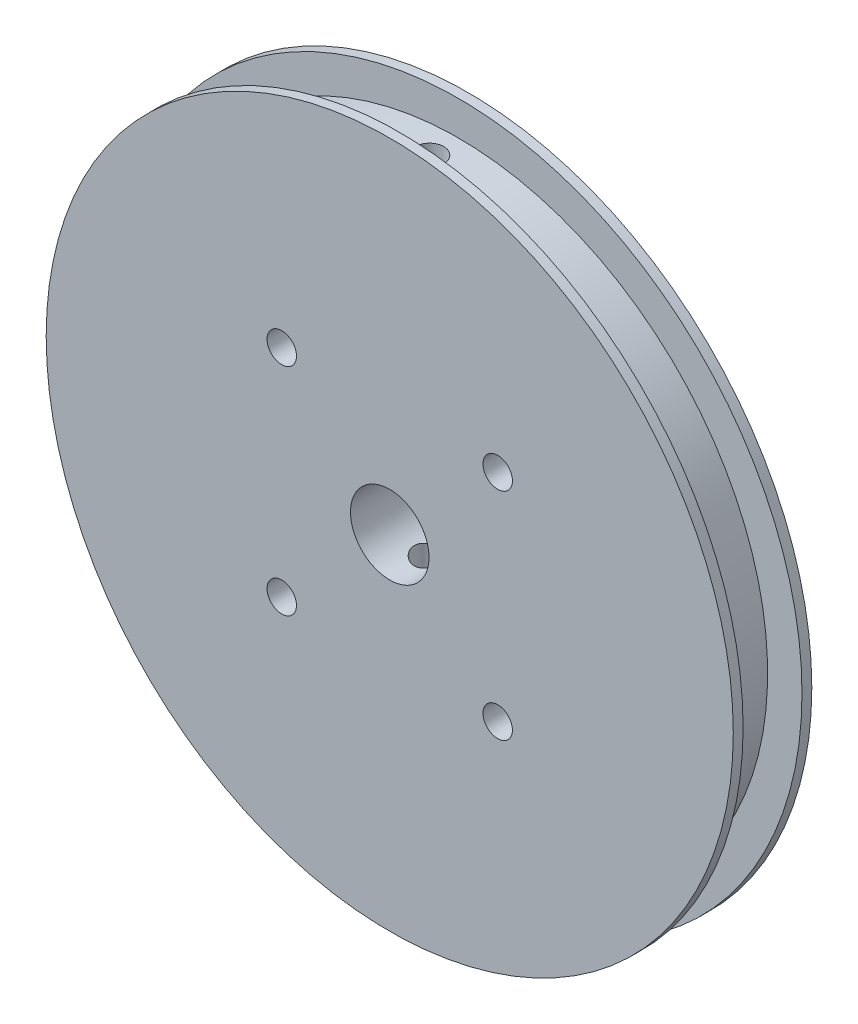
ISO-10303-21;
HEADER;
FILE_DESCRIPTION(('STEP AP214'),'2;1');
FILE_NAME('part.step','',(''),(''),'','','');
FILE_SCHEMA(('AUTOMOTIVE_DESIGN { 1 0 10303 214 1 1 1 1 }'));
ENDSEC;
DATA;
#1=APPLICATION_CONTEXT('core data for automotive mechanical design processes');
#2=APPLICATION_PROTOCOL_DEFINITION('international standard','automotive_design',2000,#1);
#3=PRODUCT_CONTEXT('',#1,'mechanical');
#4=PRODUCT('Part','Part','',(#3));
#5=PRODUCT_RELATED_PRODUCT_CATEGORY('part','',(#4));
#6=PRODUCT_DEFINITION_FORMATION('','',#4);
#7=PRODUCT_DEFINITION_CONTEXT('part definition',#1,'design');
#8=PRODUCT_DEFINITION('design','',#6,#7);
#9=PRODUCT_DEFINITION_SHAPE('','',#8);
#10=(LENGTH_UNIT() NAMED_UNIT(*) SI_UNIT(.MILLI.,.METRE.));
#11=(NAMED_UNIT(*) PLANE_ANGLE_UNIT() SI_UNIT($,.RADIAN.));
#12=(NAMED_UNIT(*) SI_UNIT($,.STERADIAN.) SOLID_ANGLE_UNIT());
#13=UNCERTAINTY_MEASURE_WITH_UNIT(LENGTH_MEASURE(1.E-05),#10,'distance_accuracy_value','');
#14=(GEOMETRIC_REPRESENTATION_CONTEXT(3) GLOBAL_UNCERTAINTY_ASSIGNED_CONTEXT((#13)) GLOBAL_UNIT_ASSIGNED_CONTEXT((#10,
#11,#12)) REPRESENTATION_CONTEXT('',''));
#15=CARTESIAN_POINT('',(0.,0.,0.));
#16=DIRECTION('',(0.,0.,1.));
#17=DIRECTION('',(1.,0.,0.));
#18=AXIS2_PLACEMENT_3D('',#15,#16,#17);
#19=CARTESIAN_POINT('',(0.,0.,8.));
#20=DIRECTION('',(0.,0.,1.));
#21=DIRECTION('',(1.,0.,0.));
#22=AXIS2_PLACEMENT_3D('',#19,#20,#21);
#23=PLANE('',#22);
#24=CARTESIAN_POINT('',(11.,-11.,8.));
#25=DIRECTION('',(0.,0.,1.));
#26=DIRECTION('',(1.,0.,0.));
#27=AXIS2_PLACEMENT_3D('',#24,#25,#26);
#28=CIRCLE('',#27,1.5);
#29=CARTESIAN_POINT('',(12.5,-11.,8.));
#30=VERTEX_POINT('',#29);
#31=EDGE_CURVE('E242',#30,#30,#28,.T.);
#32=ORIENTED_EDGE('',*,*,#31,.F.);
#33=EDGE_LOOP('',(#32));
#34=FACE_BOUND('',#33,.T.);
#35=CARTESIAN_POINT('',(-11.,-11.,8.));
#36=DIRECTION('',(0.,0.,1.));
#37=DIRECTION('',(1.,0.,0.));
#38=AXIS2_PLACEMENT_3D('',#35,#36,#37);
#39=CIRCLE('',#38,1.5);
#40=CARTESIAN_POINT('',(-9.5,-11.,8.));
#41=VERTEX_POINT('',#40);
#42=EDGE_CURVE('E244',#41,#41,#39,.T.);
#43=ORIENTED_EDGE('',*,*,#42,.F.);
#44=EDGE_LOOP('',(#43));
#45=FACE_BOUND('',#44,.T.);
#46=CARTESIAN_POINT('',(-11.,11.,8.));
#47=DIRECTION('',(0.,0.,1.));
#48=DIRECTION('',(1.,0.,0.));
#49=AXIS2_PLACEMENT_3D('',#46,#47,#48);
#50=CIRCLE('',#49,1.5);
#51=CARTESIAN_POINT('',(-9.5,11.,8.));
#52=VERTEX_POINT('',#51);
#53=EDGE_CURVE('E252',#52,#52,#50,.T.);
#54=ORIENTED_EDGE('',*,*,#53,.F.);
#55=EDGE_LOOP('',(#54));
#56=FACE_BOUND('',#55,.T.);
#57=CARTESIAN_POINT('',(11.,11.,8.));
#58=DIRECTION('',(0.,0.,1.));
#59=DIRECTION('',(1.,0.,0.));
#60=AXIS2_PLACEMENT_3D('',#57,#58,#59);
#61=CIRCLE('',#60,1.5);
#62=CARTESIAN_POINT('',(12.5,11.,8.));
#63=VERTEX_POINT('',#62);
#64=EDGE_CURVE('E258',#63,#63,#61,.T.);
#65=ORIENTED_EDGE('',*,*,#64,.F.);
#66=EDGE_LOOP('',(#65));
#67=FACE_BOUND('',#66,.T.);
#68=CARTESIAN_POINT('',(0.,0.,8.));
#69=DIRECTION('',(0.,0.,1.));
#70=DIRECTION('',(1.,0.,0.));
#71=AXIS2_PLACEMENT_3D('',#68,#69,#70);
#72=CIRCLE('',#71,35.);
#73=CARTESIAN_POINT('',(35.,0.,8.));
#74=VERTEX_POINT('',#73);
#75=EDGE_CURVE('E10',#74,#74,#72,.T.);
#76=ORIENTED_EDGE('',*,*,#75,.T.);
#77=EDGE_LOOP('',(#76));
#78=FACE_BOUND('',#77,.T.);
#79=CARTESIAN_POINT('',(0.,0.,8.));
#80=DIRECTION('',(0.,0.,1.));
#81=DIRECTION('',(1.,0.,0.));
#82=AXIS2_PLACEMENT_3D('',#79,#80,#81);
#83=CIRCLE('',#82,4.);
#84=CARTESIAN_POINT('',(4.,0.,8.));
#85=VERTEX_POINT('',#84);
#86=EDGE_CURVE('E87',#85,#85,#83,.T.);
#87=ORIENTED_EDGE('',*,*,#86,.F.);
#88=EDGE_LOOP('',(#87));
#89=FACE_BOUND('',#88,.T.);
#90=ADVANCED_FACE('F33',(#34,#45,#56,#67,#78,#89),#23,.T.);
#91=CARTESIAN_POINT('',(0.,0.,0.));
#92=DIRECTION('',(0.,0.,1.));
#93=DIRECTION('',(1.,0.,0.));
#94=AXIS2_PLACEMENT_3D('',#91,#92,#93);
#95=PLANE('',#94);
#96=CARTESIAN_POINT('',(11.,-11.,0.));
#97=DIRECTION('',(0.,0.,1.));
#98=DIRECTION('',(1.,0.,0.));
#99=AXIS2_PLACEMENT_3D('',#96,#97,#98);
#100=CIRCLE('',#99,1.5);
#101=CARTESIAN_POINT('',(12.5,-11.,0.));
#102=VERTEX_POINT('',#101);
#103=EDGE_CURVE('E240',#102,#102,#100,.F.);
#104=ORIENTED_EDGE('',*,*,#103,.F.);
#105=EDGE_LOOP('',(#104));
#106=FACE_BOUND('',#105,.T.);
#107=CARTESIAN_POINT('',(-11.,-11.,0.));
#108=DIRECTION('',(0.,0.,1.));
#109=DIRECTION('',(1.,0.,0.));
#110=AXIS2_PLACEMENT_3D('',#107,#108,#109);
#111=CIRCLE('',#110,1.5);
#112=CARTESIAN_POINT('',(-9.5,-11.,0.));
#113=VERTEX_POINT('',#112);
#114=EDGE_CURVE('E249',#113,#113,#111,.F.);
#115=ORIENTED_EDGE('',*,*,#114,.F.);
#116=EDGE_LOOP('',(#115));
#117=FACE_BOUND('',#116,.T.);
#118=CARTESIAN_POINT('',(-11.,11.,0.));
#119=DIRECTION('',(0.,0.,1.));
#120=DIRECTION('',(1.,0.,0.));
#121=AXIS2_PLACEMENT_3D('',#118,#119,#120);
#122=CIRCLE('',#121,1.5);
#123=CARTESIAN_POINT('',(-9.5,11.,0.));
#124=VERTEX_POINT('',#123);
#125=EDGE_CURVE('E255',#124,#124,#122,.F.);
#126=ORIENTED_EDGE('',*,*,#125,.F.);
#127=EDGE_LOOP('',(#126));
#128=FACE_BOUND('',#127,.T.);
#129=CARTESIAN_POINT('',(11.,11.,0.));
#130=DIRECTION('',(0.,0.,1.));
#131=DIRECTION('',(1.,0.,0.));
#132=AXIS2_PLACEMENT_3D('',#129,#130,#131);
#133=CIRCLE('',#132,1.5);
#134=CARTESIAN_POINT('',(12.5,11.,0.));
#135=VERTEX_POINT('',#134);
#136=EDGE_CURVE('E260',#135,#135,#133,.F.);
#137=ORIENTED_EDGE('',*,*,#136,.F.);
#138=EDGE_LOOP('',(#137));
#139=FACE_BOUND('',#138,.T.);
#140=CARTESIAN_POINT('',(0.,0.,0.));
#141=DIRECTION('',(0.,0.,1.));
#142=DIRECTION('',(1.,0.,0.));
#143=AXIS2_PLACEMENT_3D('',#140,#141,#142);
#144=CIRCLE('',#143,35.);
#145=CARTESIAN_POINT('',(35.,0.,0.));
#146=VERTEX_POINT('',#145);
#147=EDGE_CURVE('E45',#146,#146,#144,.T.);
#148=ORIENTED_EDGE('',*,*,#147,.F.);
#149=EDGE_LOOP('',(#148));
#150=FACE_BOUND('',#149,.T.);
#151=CARTESIAN_POINT('',(0.,0.,0.));
#152=DIRECTION('',(0.,0.,1.));
#153=DIRECTION('',(1.,0.,0.));
#154=AXIS2_PLACEMENT_3D('',#151,#152,#153);
#155=CIRCLE('',#154,4.);
#156=CARTESIAN_POINT('',(4.,0.,0.));
#157=VERTEX_POINT('',#156);
#158=EDGE_CURVE('E84',#157,#157,#155,.T.);
#159=ORIENTED_EDGE('',*,*,#158,.T.);
#160=EDGE_LOOP('',(#159));
#161=FACE_BOUND('',#160,.T.);
#162=ADVANCED_FACE('F106',(#106,#117,#128,#139,#150,#161),#95,.F.);
#163=CARTESIAN_POINT('',(0.,0.,8.));
#164=DIRECTION('',(0.,0.,-1.));
#165=DIRECTION('',(-1.,0.,0.));
#166=AXIS2_PLACEMENT_3D('',#163,#164,#165);
#167=CYLINDRICAL_SURFACE('',#166,35.);
#168=ORIENTED_EDGE('',*,*,#75,.F.);
#169=EDGE_LOOP('',(#168));
#170=FACE_BOUND('',#169,.T.);
#171=CARTESIAN_POINT('',(0.,0.,7.));
#172=DIRECTION('',(0.,0.,-1.));
#173=DIRECTION('',(-1.,0.,0.));
#174=AXIS2_PLACEMENT_3D('',#171,#172,#173);
#175=CIRCLE('',#174,35.);
#176=CARTESIAN_POINT('',(-35.,0.,7.00000000000001));
#177=VERTEX_POINT('',#176);
#178=EDGE_CURVE('E50',#177,#177,#175,.T.);
#179=ORIENTED_EDGE('',*,*,#178,.F.);
#180=EDGE_LOOP('',(#179));
#181=FACE_BOUND('',#180,.T.);
#182=ADVANCED_FACE('F35',(#170,#181),#167,.T.);
#183=CARTESIAN_POINT('',(35.,0.,7.));
#184=DIRECTION('',(0.,0.,-1.));
#185=DIRECTION('',(-1.,0.,0.));
#186=AXIS2_PLACEMENT_3D('',#183,#184,#185);
#187=PLANE('',#186);
#188=ORIENTED_EDGE('',*,*,#178,.T.);
#189=EDGE_LOOP('',(#188));
#190=FACE_BOUND('',#189,.T.);
#191=CARTESIAN_POINT('',(0.,0.,7.));
#192=DIRECTION('',(0.,0.,-1.));
#193=DIRECTION('',(-1.,0.,0.));
#194=AXIS2_PLACEMENT_3D('',#191,#192,#193);
#195=CIRCLE('',#194,31.5);
#196=CARTESIAN_POINT('',(-31.5,0.,7.00000000000001));
#197=VERTEX_POINT('',#196);
#198=EDGE_CURVE('E95',#197,#197,#195,.T.);
#199=ORIENTED_EDGE('',*,*,#198,.F.);
#200=EDGE_LOOP('',(#199));
#201=FACE_BOUND('',#200,.T.);
#202=ADVANCED_FACE('F102',(#190,#201),#187,.T.);
#203=CARTESIAN_POINT('',(0.,0.,-14.621584360084));
#204=DIRECTION('',(0.,0.,-1.));
#205=DIRECTION('',(-1.,0.,0.));
#206=AXIS2_PLACEMENT_3D('',#203,#204,#205);
#207=CYLINDRICAL_SURFACE('',#206,31.5);
#208=CARTESIAN_POINT('',(0.,-31.5,5.5));
#209=CARTESIAN_POINT('',(0.084204455848316,-31.499999521691,5.49999628203976));
#210=CARTESIAN_POINT('',(0.168468751712296,-31.4996587453911,5.49288579782181));
#211=CARTESIAN_POINT('',(0.334673149945299,-31.4983320818958,5.46462130354209));
#212=CARTESIAN_POINT('',(0.416610389150941,-31.497345433105,5.44345071375604));
#213=CARTESIAN_POINT('',(0.575728966819689,-31.4948387059078,5.3876731986805));
#214=CARTESIAN_POINT('',(0.65291269202419,-31.4933188978105,5.35307308115247));
#215=CARTESIAN_POINT('',(0.800355556424464,-31.4899170574378,5.27142904265496));
#216=CARTESIAN_POINT('',(0.87061633291434,-31.4880351111214,5.22438807371946));
#217=CARTESIAN_POINT('',(1.00230519603713,-31.4841187742428,5.11914877267684));
#218=CARTESIAN_POINT('',(1.06372606919979,-31.4820842612201,5.06094141799967));
#219=CARTESIAN_POINT('',(1.17593020040086,-31.4780931511996,4.935039492245));
#220=CARTESIAN_POINT('',(1.22671302550478,-31.4761365573755,4.86734453523953));
#221=CARTESIAN_POINT('',(1.31621879743016,-31.4725210752653,4.72435196387642));
#222=CARTESIAN_POINT('',(1.35493620473411,-31.4708623238734,4.64905087831281));
#223=CARTESIAN_POINT('',(1.41917652846051,-31.4680310454237,4.49300802714207));
#224=CARTESIAN_POINT('',(1.44469953813332,-31.4668585149296,4.41226629999079));
#225=CARTESIAN_POINT('',(1.48180775756236,-31.4651329921152,4.24769964793653));
#226=CARTESIAN_POINT('',(1.49340362509042,-31.464579526077,4.16387713130643));
#227=CARTESIAN_POINT('',(1.50236127501763,-31.4641531218559,3.9954736242041));
#228=CARTESIAN_POINT('',(1.49972316167506,-31.4642801786886,3.91089263929188));
#229=CARTESIAN_POINT('',(1.48029662365738,-31.4652000518241,3.74344555546357));
#230=CARTESIAN_POINT('',(1.46351971261308,-31.465992326419,3.66057811739432));
#231=CARTESIAN_POINT('',(1.41630965318367,-31.4681524825313,3.49883707195585));
#232=CARTESIAN_POINT('',(1.38587645109471,-31.4695203663124,3.41996348029392));
#233=CARTESIAN_POINT('',(1.31220453600091,-31.4726781890425,3.26841195897975));
#234=CARTESIAN_POINT('',(1.26896056956648,-31.474468301077,3.19573658686635));
#235=CARTESIAN_POINT('',(1.17089849655754,-31.4782686350107,3.05867247094425));
#236=CARTESIAN_POINT('',(1.11608031631733,-31.4802788583107,2.9942837798815));
#237=CARTESIAN_POINT('',(0.996360907755262,-31.4842952453966,2.87555376581213));
#238=CARTESIAN_POINT('',(0.931449707672944,-31.4863014031584,2.82122249694881));
#239=CARTESIAN_POINT('',(0.793421911843063,-31.4900816138081,2.72422705618964));
#240=CARTESIAN_POINT('',(0.720305314195427,-31.4918556666422,2.68156288699548));
#241=CARTESIAN_POINT('',(0.567936393011281,-31.4949717919896,2.60911370967763));
#242=CARTESIAN_POINT('',(0.4886839047752,-31.4963138529025,2.57932904740707));
#243=CARTESIAN_POINT('',(0.326295483006588,-31.498414566215,2.533490910148));
#244=CARTESIAN_POINT('',(0.243159575861256,-31.4991732225783,2.51743734187326));
#245=CARTESIAN_POINT('',(0.0754515337297928,-31.5000211133096,2.49952947567241));
#246=CARTESIAN_POINT('',(-0.00911911303917941,-31.5001110033461,2.49766127017037));
#247=CARTESIAN_POINT('',(-0.177372714227648,-31.4996129706397,2.50814087424912));
#248=CARTESIAN_POINT('',(-0.261055671304648,-31.4990250499266,2.520488641259));
#249=CARTESIAN_POINT('',(-0.425119500667629,-31.4972380426662,2.55903817194659));
#250=CARTESIAN_POINT('',(-0.505501867140966,-31.4960392360398,2.5852335905423));
#251=CARTESIAN_POINT('',(-0.660728763660753,-31.4931654431547,2.65072840035203));
#252=CARTESIAN_POINT('',(-0.735573264819049,-31.4914904544122,2.6900278599171));
#253=CARTESIAN_POINT('',(-0.877663753715548,-31.4878511294527,2.78065082274801));
#254=CARTESIAN_POINT('',(-0.944903786197755,-31.4858865692001,2.83198365431255));
#255=CARTESIAN_POINT('',(-1.06981677218627,-31.4818901191697,2.94520257219547));
#256=CARTESIAN_POINT('',(-1.12748966970351,-31.4798582289981,3.00708872026996));
#257=CARTESIAN_POINT('',(-1.23167803462212,-31.4759542727721,3.13971734834539));
#258=CARTESIAN_POINT('',(-1.27818450758988,-31.4740823363353,3.2104668983864));
#259=CARTESIAN_POINT('',(-1.3586584056499,-31.470711407541,3.35877824808428));
#260=CARTESIAN_POINT('',(-1.39262588151734,-31.4692124136734,3.4363400201543));
#261=CARTESIAN_POINT('',(-1.44704187510975,-31.4667573256386,3.59604071934477));
#262=CARTESIAN_POINT('',(-1.46749613899398,-31.4658010007393,3.67817768484579));
#263=CARTESIAN_POINT('',(-1.49432388586262,-31.4645384401995,3.84472469373968));
#264=CARTESIAN_POINT('',(-1.50069743894383,-31.4642322013228,3.92913472581462));
#265=CARTESIAN_POINT('',(-1.49918216482736,-31.4643044284398,4.09774221147799));
#266=CARTESIAN_POINT('',(-1.49130748991857,-31.4646822150142,4.1819397929119));
#267=CARTESIAN_POINT('',(-1.4615485309083,-31.4660784774312,4.34781611339455));
#268=CARTESIAN_POINT('',(-1.43966421992262,-31.4670969545033,4.42949484760935));
#269=CARTESIAN_POINT('',(-1.38251002568609,-31.4696596550276,4.58801806504841));
#270=CARTESIAN_POINT('',(-1.34724001966805,-31.4712038833017,4.66486250392729));
#271=CARTESIAN_POINT('',(-1.264318206725,-31.4746439832772,4.81153975500084));
#272=CARTESIAN_POINT('',(-1.21666678952803,-31.4765398439098,4.88137278779671));
#273=CARTESIAN_POINT('',(-1.11028463060226,-31.4804716566092,5.01211528835167));
#274=CARTESIAN_POINT('',(-1.05154412998328,-31.4825077310603,5.07301681145825));
#275=CARTESIAN_POINT('',(-0.924655641705977,-31.4864896760628,5.18411288402898));
#276=CARTESIAN_POINT('',(-0.856505341117788,-31.488435524279,5.23430479332447));
#277=CARTESIAN_POINT('',(-0.712682232586394,-31.4920189862803,5.32257814692136));
#278=CARTESIAN_POINT('',(-0.637002616039989,-31.4936563171366,5.36064849688089));
#279=CARTESIAN_POINT('',(-0.480374846358472,-31.49643391671,5.42349726703385));
#280=CARTESIAN_POINT('',(-0.399433052706205,-31.4975747730515,5.4482914089264));
#281=CARTESIAN_POINT('',(-0.264989270668426,-31.4989286585712,5.47737061564));
#282=CARTESIAN_POINT('',(-0.212358375591075,-31.4993286492641,5.48584582353401));
#283=CARTESIAN_POINT('',(-0.106492966230843,-31.4998644711397,5.49716168933256));
#284=CARTESIAN_POINT('',(-0.0532584524123417,-31.5000003025255,5.50000235157162));
#285=CARTESIAN_POINT('',(0.,-31.5,5.5));
#286=B_SPLINE_CURVE_WITH_KNOTS('',3,(#208,#209,#210,#211,#212,#213,#214,#215,#216,#217,#218,
#219,#220,#221,#222,#223,#224,#225,#226,#227,#228,#229,#230,#231,#232,#233,#234,#235,#236,#237,
#238,#239,#240,#241,#242,#243,#244,#245,#246,#247,#248,#249,#250,#251,#252,#253,#254,#255,#256,
#257,#258,#259,#260,#261,#262,#263,#264,#265,#266,#267,#268,#269,#270,#271,#272,#273,#274,#275,
#276,#277,#278,#279,#280,#281,#282,#283,#284,#285),.UNSPECIFIED.,.T.,.F.,(4,2,2,2,2,2,2,2,2,2,2,
2,2,2,2,2,2,2,2,2,2,2,2,2,2,2,2,2,2,2,2,2,2,2,2,2,2,2,4),(0.,0.25241895622826,0.505136095503246,
0.757725293142997,1.01025460871384,1.26298883696178,1.51573334868626,1.76859373098495,
2.0214523261884,2.27411729733235,2.52678041780784,2.77923798600517,3.03169654700951,
3.28425877969904,3.53682261990499,3.78963759397969,4.04245262659729,4.29527444763009,
4.54809455102962,4.80066675316601,5.05323819895602,5.30569401508849,5.55815114805832,
5.81080463738787,6.06345960525139,6.31631740630283,6.56917418342566,6.82192337013215,
7.07467129859598,7.32716831878449,7.57966582351067,7.83216564407918,8.08465751770712,
8.33737264018958,8.59014999102645,8.84315803744839,9.09586580512913,9.25551832202427,
9.41517071610271),.UNSPECIFIED.);
#287=CARTESIAN_POINT('',(0.,-31.5,5.5));
#288=VERTEX_POINT('',#287);
#289=EDGE_CURVE('E58',#288,#288,#286,.T.);
#290=ORIENTED_EDGE('',*,*,#289,.T.);
#291=EDGE_LOOP('',(#290));
#292=FACE_BOUND('',#291,.T.);
#293=CARTESIAN_POINT('',(0.,31.5,2.5));
#294=CARTESIAN_POINT('',(-0.0842044558483151,31.499999521691,2.50000371796024));
#295=CARTESIAN_POINT('',(-0.168468751712295,31.4996587453911,2.50711420217819));
#296=CARTESIAN_POINT('',(-0.334673149945298,31.4983320818958,2.53537869645791));
#297=CARTESIAN_POINT('',(-0.41661038915094,31.497345433105,2.55654928624396));
#298=CARTESIAN_POINT('',(-0.575728966819689,31.4948387059078,2.6123268013195));
#299=CARTESIAN_POINT('',(-0.65291269202419,31.4933188978105,2.64692691884753));
#300=CARTESIAN_POINT('',(-0.800355556424463,31.4899170574378,2.72857095734504));
#301=CARTESIAN_POINT('',(-0.870616332914339,31.4880351111214,2.77561192628054));
#302=CARTESIAN_POINT('',(-1.00230519603713,31.4841187742428,2.88085122732316));
#303=CARTESIAN_POINT('',(-1.06372606919979,31.4820842612201,2.93905858200033));
#304=CARTESIAN_POINT('',(-1.17593020040086,31.4780931511996,3.064960507755));
#305=CARTESIAN_POINT('',(-1.22671302550478,31.4761365573755,3.13265546476047));
#306=CARTESIAN_POINT('',(-1.31621879743016,31.4725210752653,3.27564803612357));
#307=CARTESIAN_POINT('',(-1.35493620473411,31.4708623238734,3.35094912168719));
#308=CARTESIAN_POINT('',(-1.41917652846051,31.4680310454237,3.50699197285793));
#309=CARTESIAN_POINT('',(-1.44469953813332,31.4668585149296,3.5877337000092));
#310=CARTESIAN_POINT('',(-1.48180775756236,31.4651329921152,3.75230035206347));
#311=CARTESIAN_POINT('',(-1.49340362509042,31.464579526077,3.83612286869357));
#312=CARTESIAN_POINT('',(-1.50236127501763,31.4641531218559,4.0045263757959));
#313=CARTESIAN_POINT('',(-1.49972316167506,31.4642801786886,4.08910736070812));
#314=CARTESIAN_POINT('',(-1.48029662365738,31.4652000518241,4.25655444453643));
#315=CARTESIAN_POINT('',(-1.46351971261308,31.465992326419,4.33942188260568));
#316=CARTESIAN_POINT('',(-1.41630965318367,31.4681524825313,4.50116292804415));
#317=CARTESIAN_POINT('',(-1.38587645109471,31.4695203663124,4.58003651970608));
#318=CARTESIAN_POINT('',(-1.31220453600091,31.4726781890425,4.73158804102025));
#319=CARTESIAN_POINT('',(-1.26896056956648,31.474468301077,4.80426341313365));
#320=CARTESIAN_POINT('',(-1.17089849655754,31.4782686350107,4.94132752905575));
#321=CARTESIAN_POINT('',(-1.11608031631733,31.4802788583107,5.0057162201185));
#322=CARTESIAN_POINT('',(-0.996360907755261,31.4842952453966,5.12444623418787));
#323=CARTESIAN_POINT('',(-0.931449707672943,31.4863014031584,5.17877750305119));
#324=CARTESIAN_POINT('',(-0.793421911843061,31.4900816138081,5.27577294381036));
#325=CARTESIAN_POINT('',(-0.720305314195426,31.4918556666422,5.31843711300452));
#326=CARTESIAN_POINT('',(-0.56793639301128,31.4949717919896,5.39088629032237));
#327=CARTESIAN_POINT('',(-0.488683904775199,31.4963138529025,5.42067095259293));
#328=CARTESIAN_POINT('',(-0.326295483006587,31.498414566215,5.466509089852));
#329=CARTESIAN_POINT('',(-0.243159575861255,31.4991732225783,5.48256265812674));
#330=CARTESIAN_POINT('',(-0.0754515337297919,31.5000211133096,5.50047052432759));
#331=CARTESIAN_POINT('',(0.00911911303918021,31.5001110033461,5.50233872982962));
#332=CARTESIAN_POINT('',(0.177372714227649,31.4996129706397,5.49185912575088));
#333=CARTESIAN_POINT('',(0.261055671304649,31.4990250499266,5.479511358741));
#334=CARTESIAN_POINT('',(0.425119500667631,31.4972380426662,5.44096182805341));
#335=CARTESIAN_POINT('',(0.505501867140968,31.4960392360398,5.4147664094577));
#336=CARTESIAN_POINT('',(0.660728763660755,31.4931654431547,5.34927159964797));
#337=CARTESIAN_POINT('',(0.735573264819051,31.4914904544122,5.3099721400829));
#338=CARTESIAN_POINT('',(0.87766375371555,31.4878511294527,5.21934917725199));
#339=CARTESIAN_POINT('',(0.944903786197757,31.4858865692001,5.16801634568744));
#340=CARTESIAN_POINT('',(1.06981677218627,31.4818901191697,5.05479742780453));
#341=CARTESIAN_POINT('',(1.12748966970351,31.4798582289981,4.99291127973003));
#342=CARTESIAN_POINT('',(1.23167803462213,31.4759542727721,4.86028265165461));
#343=CARTESIAN_POINT('',(1.27818450758988,31.4740823363353,4.7895331016136));
#344=CARTESIAN_POINT('',(1.35865840564991,31.470711407541,4.64122175191572));
#345=CARTESIAN_POINT('',(1.39262588151735,31.4692124136734,4.5636599798457));
#346=CARTESIAN_POINT('',(1.44704187510975,31.4667573256386,4.40395928065523));
#347=CARTESIAN_POINT('',(1.46749613899398,31.4658010007393,4.32182231515421));
#348=CARTESIAN_POINT('',(1.49432388586262,31.4645384401995,4.15527530626032));
#349=CARTESIAN_POINT('',(1.50069743894383,31.4642322013228,4.07086527418538));
#350=CARTESIAN_POINT('',(1.49918216482736,31.4643044284398,3.90225778852201));
#351=CARTESIAN_POINT('',(1.49130748991858,31.4646822150142,3.8180602070881));
#352=CARTESIAN_POINT('',(1.4615485309083,31.4660784774312,3.65218388660545));
#353=CARTESIAN_POINT('',(1.43966421992262,31.4670969545033,3.57050515239065));
#354=CARTESIAN_POINT('',(1.38251002568609,31.4696596550276,3.41198193495159));
#355=CARTESIAN_POINT('',(1.34724001966805,31.4712038833017,3.33513749607271));
#356=CARTESIAN_POINT('',(1.264318206725,31.4746439832772,3.18846024499915));
#357=CARTESIAN_POINT('',(1.21666678952803,31.4765398439098,3.11862721220329));
#358=CARTESIAN_POINT('',(1.11028463060226,31.4804716566092,2.98788471164832));
#359=CARTESIAN_POINT('',(1.05154412998328,31.4825077310603,2.92698318854175));
#360=CARTESIAN_POINT('',(0.924655641705977,31.4864896760628,2.81588711597102));
#361=CARTESIAN_POINT('',(0.856505341117788,31.488435524279,2.76569520667553));
#362=CARTESIAN_POINT('',(0.712682232586395,31.4920189862803,2.67742185307863));
#363=CARTESIAN_POINT('',(0.63700261603999,31.4936563171366,2.63935150311911));
#364=CARTESIAN_POINT('',(0.480374846358473,31.49643391671,2.57650273296615));
#365=CARTESIAN_POINT('',(0.399433052706206,31.4975747730515,2.5517085910736));
#366=CARTESIAN_POINT('',(0.264989270668427,31.4989286585712,2.52262938436));
#367=CARTESIAN_POINT('',(0.212358375591076,31.4993286492641,2.51415417646599));
#368=CARTESIAN_POINT('',(0.106492966230844,31.4998644711397,2.50283831066744));
#369=CARTESIAN_POINT('',(0.0532584524123427,31.5000003025255,2.49999764842838));
#370=CARTESIAN_POINT('',(0.,31.5,2.5));
#371=B_SPLINE_CURVE_WITH_KNOTS('',3,(#293,#294,#295,#296,#297,#298,#299,#300,#301,#302,#303,
#304,#305,#306,#307,#308,#309,#310,#311,#312,#313,#314,#315,#316,#317,#318,#319,#320,#321,#322,
#323,#324,#325,#326,#327,#328,#329,#330,#331,#332,#333,#334,#335,#336,#337,#338,#339,#340,#341,
#342,#343,#344,#345,#346,#347,#348,#349,#350,#351,#352,#353,#354,#355,#356,#357,#358,#359,#360,
#361,#362,#363,#364,#365,#366,#367,#368,#369,#370),.UNSPECIFIED.,.T.,.F.,(4,2,2,2,2,2,2,2,2,2,2,
2,2,2,2,2,2,2,2,2,2,2,2,2,2,2,2,2,2,2,2,2,2,2,2,2,2,2,4),(0.,0.25241895622826,0.505136095503246,
0.757725293142997,1.01025460871384,1.26298883696178,1.51573334868626,1.76859373098495,
2.0214523261884,2.27411729733235,2.52678041780784,2.77923798600517,3.03169654700951,
3.28425877969904,3.53682261990499,3.78963759397969,4.04245262659729,4.29527444763009,
4.54809455102962,4.80066675316601,5.05323819895602,5.30569401508849,5.55815114805832,
5.81080463738787,6.06345960525139,6.31631740630283,6.56917418342566,6.82192337013215,
7.07467129859598,7.32716831878449,7.57966582351067,7.83216564407918,8.08465751770712,
8.33737264018958,8.59014999102645,8.84315803744839,9.09586580512913,9.25551832202427,
9.41517071610271),.UNSPECIFIED.);
#372=CARTESIAN_POINT('',(0.,31.5,2.5));
#373=VERTEX_POINT('',#372);
#374=EDGE_CURVE('E80',#373,#373,#371,.T.);
#375=ORIENTED_EDGE('',*,*,#374,.F.);
#376=EDGE_LOOP('',(#375));
#377=FACE_BOUND('',#376,.T.);
#378=ORIENTED_EDGE('',*,*,#198,.T.);
#379=EDGE_LOOP('',(#378));
#380=FACE_BOUND('',#379,.T.);
#381=CARTESIAN_POINT('',(0.,0.,1.));
#382=DIRECTION('',(0.,0.,-1.));
#383=DIRECTION('',(-1.,0.,0.));
#384=AXIS2_PLACEMENT_3D('',#381,#382,#383);
#385=CIRCLE('',#384,31.5);
#386=CARTESIAN_POINT('',(-31.5,0.,1.00000000000001));
#387=VERTEX_POINT('',#386);
#388=EDGE_CURVE('E93',#387,#387,#385,.T.);
#389=ORIENTED_EDGE('',*,*,#388,.F.);
#390=EDGE_LOOP('',(#389));
#391=FACE_BOUND('',#390,.T.);
#392=ADVANCED_FACE('F113',(#292,#377,#380,#391),#207,.T.);
#393=CARTESIAN_POINT('',(35.,0.,1.));
#394=DIRECTION('',(0.,0.,1.));
#395=DIRECTION('',(1.,0.,0.));
#396=AXIS2_PLACEMENT_3D('',#393,#394,#395);
#397=PLANE('',#396);
#398=ORIENTED_EDGE('',*,*,#388,.T.);
#399=EDGE_LOOP('',(#398));
#400=FACE_BOUND('',#399,.T.);
#401=CARTESIAN_POINT('',(0.,0.,1.00000000000001));
#402=DIRECTION('',(0.,0.,-1.));
#403=DIRECTION('',(-1.,0.,0.));
#404=AXIS2_PLACEMENT_3D('',#401,#402,#403);
#405=CIRCLE('',#404,35.);
#406=CARTESIAN_POINT('',(-35.,0.,1.00000000000001));
#407=VERTEX_POINT('',#406);
#408=EDGE_CURVE('E90',#407,#407,#405,.T.);
#409=ORIENTED_EDGE('',*,*,#408,.F.);
#410=EDGE_LOOP('',(#409));
#411=FACE_BOUND('',#410,.T.);
#412=ADVANCED_FACE('F117',(#400,#411),#397,.T.);
#413=ORIENTED_EDGE('',*,*,#147,.T.);
#414=EDGE_LOOP('',(#413));
#415=FACE_BOUND('',#414,.T.);
#416=ORIENTED_EDGE('',*,*,#408,.T.);
#417=EDGE_LOOP('',(#416));
#418=FACE_BOUND('',#417,.T.);
#419=ADVANCED_FACE('F108',(#415,#418),#167,.T.);
#420=CARTESIAN_POINT('',(0.,0.,19.3137084989848));
#421=DIRECTION('',(0.,0.,-1.));
#422=DIRECTION('',(-1.,0.,0.));
#423=AXIS2_PLACEMENT_3D('',#420,#421,#422);
#424=CYLINDRICAL_SURFACE('',#423,4.);
#425=CARTESIAN_POINT('',(0.,-3.99999999999999,5.5));
#426=CARTESIAN_POINT('',(0.0812350589378535,-4.00000217456151,5.50000290230311));
#427=CARTESIAN_POINT('',(0.162450241781793,-3.99750379283184,5.49338023975162));
#428=CARTESIAN_POINT('',(0.322453452352362,-3.98778696006928,5.46717180473007));
#429=CARTESIAN_POINT('',(0.401241827987616,-3.98056918893993,5.44758789952943));
#430=CARTESIAN_POINT('',(0.554060784990879,-3.96218832391545,5.39624699822824));
#431=CARTESIAN_POINT('',(0.628100224162278,-3.9510328434944,5.36451348317821));
#432=CARTESIAN_POINT('',(0.769799310160254,-3.92588767765353,5.28989358698418));
#433=CARTESIAN_POINT('',(0.83745723917788,-3.91189723227548,5.24700421445584));
#434=CARTESIAN_POINT('',(0.967346417045826,-3.88186246971217,5.14938746892909));
#435=CARTESIAN_POINT('',(1.02927073015119,-3.86576002583566,5.0942697377406));
#436=CARTESIAN_POINT('',(1.14324421474363,-3.83360220871327,4.97458956534116));
#437=CARTESIAN_POINT('',(1.19529036359203,-3.81754685135033,4.91002424391212));
#438=CARTESIAN_POINT('',(1.28998202215985,-3.78662470617731,4.77028253247679));
#439=CARTESIAN_POINT('',(1.3321939319576,-3.77182648820818,4.69479563345418));
#440=CARTESIAN_POINT('',(1.40318646334084,-3.74599860237433,4.53715164583148));
#441=CARTESIAN_POINT('',(1.43197244961239,-3.73496742975881,4.4549972368449));
#442=CARTESIAN_POINT('',(1.47408431017549,-3.71854412824136,4.2898832597418));
#443=CARTESIAN_POINT('',(1.48799593218558,-3.71293924350838,4.20709496156456));
#444=CARTESIAN_POINT('',(1.50179556531648,-3.70738061461215,4.04018384200616));
#445=CARTESIAN_POINT('',(1.50168936802631,-3.70742453659305,3.95606158612553));
#446=CARTESIAN_POINT('',(1.48790429610018,-3.71297511632055,3.79423047478704));
#447=CARTESIAN_POINT('',(1.47503808509003,-3.71815468871122,3.71643909395582));
#448=CARTESIAN_POINT('',(1.4374416786833,-3.7328493805953,3.56421284959468));
#449=CARTESIAN_POINT('',(1.41270969663258,-3.74236515298863,3.48977849338612));
#450=CARTESIAN_POINT('',(1.35163748571904,-3.76485702190253,3.34472293227177));
#451=CARTESIAN_POINT('',(1.31508648737101,-3.77789517988166,3.2742005138787));
#452=CARTESIAN_POINT('',(1.23156073762698,-3.80594210139319,3.14005426240903));
#453=CARTESIAN_POINT('',(1.18458238728897,-3.82095154457158,3.0764328224803));
#454=CARTESIAN_POINT('',(1.07781780766549,-3.85248038859113,2.95339633634912));
#455=CARTESIAN_POINT('',(1.01738298716956,-3.86903347455671,2.89455135925191));
#456=CARTESIAN_POINT('',(0.887312590819021,-3.90091728164085,2.7876620337942));
#457=CARTESIAN_POINT('',(0.817675603497364,-3.91624781465952,2.73961934539433));
#458=CARTESIAN_POINT('',(0.66972343699242,-3.9442639480908,2.65506960293748));
#459=CARTESIAN_POINT('',(0.59129071384472,-3.95690498259616,2.61875241877894));
#460=CARTESIAN_POINT('',(0.428836850524584,-3.97778718326962,2.56001739572996));
#461=CARTESIAN_POINT('',(0.344818210845768,-3.98603030341493,2.53759338343888));
#462=CARTESIAN_POINT('',(0.178375243148666,-3.99684443228065,2.50837721245806));
#463=CARTESIAN_POINT('',(0.09610361956221,-3.99969369025686,2.50081739361749));
#464=CARTESIAN_POINT('',(-0.0685724752550237,-4.00025893700126,2.49930893610008));
#465=CARTESIAN_POINT('',(-0.150976912983372,-3.99797606386863,2.50535727968322));
#466=CARTESIAN_POINT('',(-0.310262048561859,-3.98871709772643,2.53031004230867));
#467=CARTESIAN_POINT('',(-0.387233328007336,-3.98192470962305,2.54871154373708));
#468=CARTESIAN_POINT('',(-0.536941754957221,-3.96451477091717,2.59718607254732));
#469=CARTESIAN_POINT('',(-0.609678350347534,-3.9538967228203,2.62726061794804));
#470=CARTESIAN_POINT('',(-0.751247765110155,-3.92949624407681,2.69918641243947));
#471=CARTESIAN_POINT('',(-0.819903083557796,-3.91563000209348,2.74135772922339));
#472=CARTESIAN_POINT('',(-0.949392711726626,-3.88626671564664,2.83591810317156));
#473=CARTESIAN_POINT('',(-1.01022412027045,-3.87076907009516,2.88831093254515));
#474=CARTESIAN_POINT('',(-1.12603079874454,-3.8387332949099,3.00540412212427));
#475=CARTESIAN_POINT('',(-1.18046154123568,-3.82218696503729,3.0706421827727));
#476=CARTESIAN_POINT('',(-1.27771050031903,-3.79078815746854,3.20965138470766));
#477=CARTESIAN_POINT('',(-1.32052767414518,-3.77593583194399,3.2834232913885));
#478=CARTESIAN_POINT('',(-1.39337773518998,-3.74966829822463,3.43801598677231));
#479=CARTESIAN_POINT('',(-1.42335685446918,-3.73826760328493,3.51886474591044));
#480=CARTESIAN_POINT('',(-1.46907883466889,-3.72054032891005,3.68500976368782));
#481=CARTESIAN_POINT('',(-1.48483050305535,-3.71421061057491,3.77030323619812));
#482=CARTESIAN_POINT('',(-1.50086347097839,-3.70775894792573,3.93701615954111));
#483=CARTESIAN_POINT('',(-1.50207331495837,-3.70726444523341,4.01833263171689));
#484=CARTESIAN_POINT('',(-1.49136715641593,-3.71158412745292,4.17994531627617));
#485=CARTESIAN_POINT('',(-1.47945239850123,-3.71639780898899,4.26024162467158));
#486=CARTESIAN_POINT('',(-1.44355815630242,-3.73048141585432,4.41504722671655));
#487=CARTESIAN_POINT('',(-1.41995798316524,-3.73961085376663,4.48965834624535));
#488=CARTESIAN_POINT('',(-1.3616969677992,-3.76121548297845,4.63390550849442));
#489=CARTESIAN_POINT('',(-1.32703332944944,-3.77369151995215,4.70354028807014));
#490=CARTESIAN_POINT('',(-1.24552075938154,-3.80139723903965,4.83982678969763));
#491=CARTESIAN_POINT('',(-1.1981283280301,-3.81673698440964,4.90613079679991));
#492=CARTESIAN_POINT('',(-1.09334485729906,-3.84806246757177,5.0301415609712));
#493=CARTESIAN_POINT('',(-1.03595064012808,-3.86404840943145,5.08784557478675));
#494=CARTESIAN_POINT('',(-0.909080396784621,-3.89590424609881,5.19620195582184));
#495=CARTESIAN_POINT('',(-0.83911864421299,-3.91172104900645,5.24630375343467));
#496=CARTESIAN_POINT('',(-0.691213223200818,-3.94054514457031,5.33402265527656));
#497=CARTESIAN_POINT('',(-0.613268934090619,-3.95355221851559,5.37163878773637));
#498=CARTESIAN_POINT('',(-0.44799908200231,-3.9757429260668,5.43437682904833));
#499=CARTESIAN_POINT('',(-0.360413422234207,-3.98473657158356,5.4588870646019));
#500=CARTESIAN_POINT('',(-0.181875733606382,-3.99686242179586,5.49169295992068));
#501=CARTESIAN_POINT('',(-0.0909254163648586,-3.99999756603966,5.49999675148732));
#502=CARTESIAN_POINT('',(0.,-3.99999999999999,5.5));
#503=B_SPLINE_CURVE_WITH_KNOTS('',3,(#425,#426,#427,#428,#429,#430,#431,#432,#433,#434,#435,
#436,#437,#438,#439,#440,#441,#442,#443,#444,#445,#446,#447,#448,#449,#450,#451,#452,#453,#454,
#455,#456,#457,#458,#459,#460,#461,#462,#463,#464,#465,#466,#467,#468,#469,#470,#471,#472,#473,
#474,#475,#476,#477,#478,#479,#480,#481,#482,#483,#484,#485,#486,#487,#488,#489,#490,#491,#492,
#493,#494,#495,#496,#497,#498,#499,#500,#501,#502),.UNSPECIFIED.,.T.,.F.,(4,2,2,2,2,2,2,2,2,2,2,
2,2,2,2,2,2,2,2,2,2,2,2,2,2,2,2,2,2,2,2,2,2,2,2,2,2,2,4),(0.,0.24336980156056,0.486704549530461,
0.729571369213573,0.97250337960949,1.22473618582715,1.47704604925622,1.73896674501659,
2.00078269352134,2.25185874416901,2.50283106079707,2.73878345119971,2.97477138060589,
3.21522408387018,3.45575990744259,3.71246153335813,3.96920257905066,4.22991375286075,
4.49050899698846,4.73725019635925,4.9839366839052,5.2211443792384,5.45838293254453,
5.702592218596,5.94689180019868,6.20536519455658,6.46386178920141,6.72343066727204,
6.98283874956507,7.22558763480252,7.46831350211259,7.70363142426533,7.93900886656506,
8.18672471884271,8.43451941997062,8.69572329654039,8.95694749805102,9.22948515032042,
9.50188601796127),.UNSPECIFIED.);
#504=CARTESIAN_POINT('',(0.,-3.99999999999999,5.5));
#505=VERTEX_POINT('',#504);
#506=EDGE_CURVE('E37',#505,#505,#503,.T.);
#507=ORIENTED_EDGE('',*,*,#506,.F.);
#508=EDGE_LOOP('',(#507));
#509=FACE_BOUND('',#508,.T.);
#510=CARTESIAN_POINT('',(0.,4.00000000000001,5.5));
#511=CARTESIAN_POINT('',(-0.0812350589378522,4.00000217456152,5.50000290230311));
#512=CARTESIAN_POINT('',(-0.162450241781791,3.99750379283184,5.49338023975162));
#513=CARTESIAN_POINT('',(-0.32245345235236,3.98778696006928,5.46717180473007));
#514=CARTESIAN_POINT('',(-0.401241827987615,3.98056918893993,5.44758789952943));
#515=CARTESIAN_POINT('',(-0.554060784990878,3.96218832391545,5.39624699822824));
#516=CARTESIAN_POINT('',(-0.628100224162277,3.9510328434944,5.36451348317821));
#517=CARTESIAN_POINT('',(-0.769799310160253,3.92588767765353,5.28989358698418));
#518=CARTESIAN_POINT('',(-0.837457239177878,3.91189723227548,5.24700421445584));
#519=CARTESIAN_POINT('',(-0.967346417045824,3.88186246971217,5.14938746892909));
#520=CARTESIAN_POINT('',(-1.02927073015119,3.86576002583566,5.0942697377406));
#521=CARTESIAN_POINT('',(-1.14324421474363,3.83360220871327,4.97458956534116));
#522=CARTESIAN_POINT('',(-1.19529036359202,3.81754685135033,4.91002424391213));
#523=CARTESIAN_POINT('',(-1.28998202215985,3.78662470617731,4.77028253247679));
#524=CARTESIAN_POINT('',(-1.3321939319576,3.77182648820818,4.69479563345418));
#525=CARTESIAN_POINT('',(-1.40318646334084,3.74599860237433,4.53715164583148));
#526=CARTESIAN_POINT('',(-1.43197244961239,3.73496742975881,4.4549972368449));
#527=CARTESIAN_POINT('',(-1.47408431017549,3.71854412824136,4.2898832597418));
#528=CARTESIAN_POINT('',(-1.48799593218558,3.71293924350838,4.20709496156456));
#529=CARTESIAN_POINT('',(-1.50179556531648,3.70738061461215,4.04018384200616));
#530=CARTESIAN_POINT('',(-1.5016893680263,3.70742453659305,3.95606158612553));
#531=CARTESIAN_POINT('',(-1.48790429610018,3.71297511632055,3.79423047478704));
#532=CARTESIAN_POINT('',(-1.47503808509003,3.71815468871122,3.71643909395582));
#533=CARTESIAN_POINT('',(-1.4374416786833,3.73284938059529,3.56421284959468));
#534=CARTESIAN_POINT('',(-1.41270969663258,3.74236515298863,3.48977849338612));
#535=CARTESIAN_POINT('',(-1.35163748571904,3.76485702190253,3.34472293227177));
#536=CARTESIAN_POINT('',(-1.31508648737101,3.77789517988166,3.2742005138787));
#537=CARTESIAN_POINT('',(-1.23156073762698,3.80594210139319,3.14005426240903));
#538=CARTESIAN_POINT('',(-1.18458238728897,3.82095154457158,3.0764328224803));
#539=CARTESIAN_POINT('',(-1.07781780766549,3.85248038859113,2.95339633634912));
#540=CARTESIAN_POINT('',(-1.01738298716955,3.86903347455671,2.89455135925191));
#541=CARTESIAN_POINT('',(-0.88731259081902,3.90091728164085,2.7876620337942));
#542=CARTESIAN_POINT('',(-0.817675603497364,3.91624781465952,2.73961934539433));
#543=CARTESIAN_POINT('',(-0.669723436992419,3.9442639480908,2.65506960293748));
#544=CARTESIAN_POINT('',(-0.591290713844719,3.95690498259616,2.61875241877894));
#545=CARTESIAN_POINT('',(-0.428836850524583,3.97778718326962,2.56001739572996));
#546=CARTESIAN_POINT('',(-0.344818210845767,3.98603030341493,2.53759338343888));
#547=CARTESIAN_POINT('',(-0.178375243148665,3.99684443228065,2.50837721245806));
#548=CARTESIAN_POINT('',(-0.0961036195622096,3.99969369025686,2.50081739361749));
#549=CARTESIAN_POINT('',(0.0685724752550239,4.00025893700126,2.49930893610008));
#550=CARTESIAN_POINT('',(0.150976912983372,3.99797606386863,2.50535727968322));
#551=CARTESIAN_POINT('',(0.310262048561859,3.98871709772643,2.53031004230867));
#552=CARTESIAN_POINT('',(0.387233328007336,3.98192470962305,2.54871154373708));
#553=CARTESIAN_POINT('',(0.536941754957221,3.96451477091717,2.59718607254732));
#554=CARTESIAN_POINT('',(0.609678350347534,3.9538967228203,2.62726061794804));
#555=CARTESIAN_POINT('',(0.751247765110156,3.92949624407681,2.69918641243947));
#556=CARTESIAN_POINT('',(0.819903083557796,3.91563000209348,2.74135772922339));
#557=CARTESIAN_POINT('',(0.949392711726626,3.88626671564664,2.83591810317156));
#558=CARTESIAN_POINT('',(1.01022412027045,3.87076907009516,2.88831093254515));
#559=CARTESIAN_POINT('',(1.12603079874454,3.8387332949099,3.00540412212427));
#560=CARTESIAN_POINT('',(1.18046154123569,3.82218696503729,3.0706421827727));
#561=CARTESIAN_POINT('',(1.27771050031903,3.79078815746854,3.20965138470766));
#562=CARTESIAN_POINT('',(1.32052767414518,3.77593583194399,3.2834232913885));
#563=CARTESIAN_POINT('',(1.39337773518998,3.74966829822463,3.43801598677231));
#564=CARTESIAN_POINT('',(1.42335685446918,3.73826760328493,3.51886474591043));
#565=CARTESIAN_POINT('',(1.46907883466889,3.72054032891005,3.68500976368782));
#566=CARTESIAN_POINT('',(1.48483050305535,3.71421061057491,3.77030323619812));
#567=CARTESIAN_POINT('',(1.50086347097839,3.70775894792573,3.93701615954111));
#568=CARTESIAN_POINT('',(1.50207331495837,3.70726444523341,4.01833263171688));
#569=CARTESIAN_POINT('',(1.49136715641593,3.71158412745292,4.17994531627616));
#570=CARTESIAN_POINT('',(1.47945239850124,3.71639780898899,4.26024162467158));
#571=CARTESIAN_POINT('',(1.44355815630242,3.73048141585432,4.41504722671655));
#572=CARTESIAN_POINT('',(1.41995798316524,3.73961085376663,4.48965834624534));
#573=CARTESIAN_POINT('',(1.3616969677992,3.76121548297845,4.63390550849442));
#574=CARTESIAN_POINT('',(1.32703332944945,3.77369151995215,4.70354028807014));
#575=CARTESIAN_POINT('',(1.24552075938154,3.80139723903965,4.83982678969763));
#576=CARTESIAN_POINT('',(1.1981283280301,3.81673698440964,4.90613079679991));
#577=CARTESIAN_POINT('',(1.09334485729906,3.84806246757177,5.0301415609712));
#578=CARTESIAN_POINT('',(1.03595064012808,3.86404840943145,5.08784557478675));
#579=CARTESIAN_POINT('',(0.909080396784623,3.89590424609881,5.19620195582184));
#580=CARTESIAN_POINT('',(0.839118644212993,3.91172104900645,5.24630375343467));
#581=CARTESIAN_POINT('',(0.691213223200822,3.94054514457031,5.33402265527655));
#582=CARTESIAN_POINT('',(0.613268934090622,3.95355221851559,5.37163878773637));
#583=CARTESIAN_POINT('',(0.447999082002313,3.9757429260668,5.43437682904833));
#584=CARTESIAN_POINT('',(0.360413422234209,3.98473657158356,5.4588870646019));
#585=CARTESIAN_POINT('',(0.181875733606383,3.99686242179587,5.49169295992068));
#586=CARTESIAN_POINT('',(0.0909254163648597,3.99999756603968,5.49999675148732));
#587=CARTESIAN_POINT('',(0.,4.00000000000001,5.5));
#588=B_SPLINE_CURVE_WITH_KNOTS('',3,(#510,#511,#512,#513,#514,#515,#516,#517,#518,#519,#520,
#521,#522,#523,#524,#525,#526,#527,#528,#529,#530,#531,#532,#533,#534,#535,#536,#537,#538,#539,
#540,#541,#542,#543,#544,#545,#546,#547,#548,#549,#550,#551,#552,#553,#554,#555,#556,#557,#558,
#559,#560,#561,#562,#563,#564,#565,#566,#567,#568,#569,#570,#571,#572,#573,#574,#575,#576,#577,
#578,#579,#580,#581,#582,#583,#584,#585,#586,#587),.UNSPECIFIED.,.T.,.F.,(4,2,2,2,2,2,2,2,2,2,2,
2,2,2,2,2,2,2,2,2,2,2,2,2,2,2,2,2,2,2,2,2,2,2,2,2,2,2,4),(0.,0.24336980156056,0.48670454953046,
0.729571369213573,0.972503379609489,1.22473618582715,1.47704604925622,1.73896674501659,
2.00078269352134,2.25185874416901,2.50283106079707,2.73878345119971,2.97477138060589,
3.21522408387018,3.45575990744259,3.71246153335813,3.96920257905066,4.22991375286075,
4.49050899698846,4.73725019635925,4.98393668390521,5.2211443792384,5.45838293254454,
5.702592218596,5.94689180019868,6.20536519455658,6.46386178920141,6.72343066727204,
6.98283874956507,7.22558763480252,7.46831350211259,7.70363142426533,7.93900886656506,
8.18672471884271,8.43451941997062,8.69572329654039,8.95694749805102,9.22948515032042,
9.50188601796127),.UNSPECIFIED.);
#589=CARTESIAN_POINT('',(0.,4.00000000000001,5.5));
#590=VERTEX_POINT('',#589);
#591=EDGE_CURVE('E54',#590,#590,#588,.T.);
#592=ORIENTED_EDGE('',*,*,#591,.F.);
#593=EDGE_LOOP('',(#592));
#594=FACE_BOUND('',#593,.T.);
#595=ORIENTED_EDGE('',*,*,#158,.F.);
#596=EDGE_LOOP('',(#595));
#597=FACE_BOUND('',#596,.T.);
#598=ORIENTED_EDGE('',*,*,#86,.T.);
#599=EDGE_LOOP('',(#598));
#600=FACE_BOUND('',#599,.T.);
#601=ADVANCED_FACE('F59',(#509,#594,#597,#600),#424,.F.);
#602=CARTESIAN_POINT('',(0.,-35.001,4.));
#603=DIRECTION('',(0.,1.,0.));
#604=DIRECTION('',(0.,0.,1.));
#605=AXIS2_PLACEMENT_3D('',#602,#603,#604);
#606=CYLINDRICAL_SURFACE('',#605,1.5);
#607=ORIENTED_EDGE('',*,*,#591,.T.);
#608=EDGE_LOOP('',(#607));
#609=FACE_BOUND('',#608,.T.);
#610=ORIENTED_EDGE('',*,*,#374,.T.);
#611=EDGE_LOOP('',(#610));
#612=FACE_BOUND('',#611,.T.);
#613=ADVANCED_FACE('F63',(#609,#612),#606,.F.);
#614=ORIENTED_EDGE('',*,*,#506,.T.);
#615=EDGE_LOOP('',(#614));
#616=FACE_BOUND('',#615,.T.);
#617=ORIENTED_EDGE('',*,*,#289,.F.);
#618=EDGE_LOOP('',(#617));
#619=FACE_BOUND('',#618,.T.);
#620=ADVANCED_FACE('F67',(#616,#619),#606,.F.);
#621=CARTESIAN_POINT('',(11.,11.,-4.24264068711928));
#622=DIRECTION('',(0.,0.,1.));
#623=DIRECTION('',(1.,0.,0.));
#624=AXIS2_PLACEMENT_3D('',#621,#622,#623);
#625=CYLINDRICAL_SURFACE('',#624,1.5);
#626=ORIENTED_EDGE('',*,*,#136,.T.);
#627=EDGE_LOOP('',(#626));
#628=FACE_BOUND('',#627,.T.);
#629=ORIENTED_EDGE('',*,*,#64,.T.);
#630=EDGE_LOOP('',(#629));
#631=FACE_BOUND('',#630,.T.);
#632=ADVANCED_FACE('F161',(#628,#631),#625,.F.);
#633=CARTESIAN_POINT('',(-11.,11.,-4.24264068711928));
#634=DIRECTION('',(0.,0.,1.));
#635=DIRECTION('',(1.,0.,0.));
#636=AXIS2_PLACEMENT_3D('',#633,#634,#635);
#637=CYLINDRICAL_SURFACE('',#636,1.5);
#638=ORIENTED_EDGE('',*,*,#125,.T.);
#639=EDGE_LOOP('',(#638));
#640=FACE_BOUND('',#639,.T.);
#641=ORIENTED_EDGE('',*,*,#53,.T.);
#642=EDGE_LOOP('',(#641));
#643=FACE_BOUND('',#642,.T.);
#644=ADVANCED_FACE('F168',(#640,#643),#637,.F.);
#645=CARTESIAN_POINT('',(-11.,-11.,-4.24264068711928));
#646=DIRECTION('',(0.,0.,1.));
#647=DIRECTION('',(1.,0.,0.));
#648=AXIS2_PLACEMENT_3D('',#645,#646,#647);
#649=CYLINDRICAL_SURFACE('',#648,1.5);
#650=ORIENTED_EDGE('',*,*,#114,.T.);
#651=EDGE_LOOP('',(#650));
#652=FACE_BOUND('',#651,.T.);
#653=ORIENTED_EDGE('',*,*,#42,.T.);
#654=EDGE_LOOP('',(#653));
#655=FACE_BOUND('',#654,.T.);
#656=ADVANCED_FACE('F177',(#652,#655),#649,.F.);
#657=CARTESIAN_POINT('',(11.,-11.,-4.24264068711928));
#658=DIRECTION('',(0.,0.,1.));
#659=DIRECTION('',(1.,0.,0.));
#660=AXIS2_PLACEMENT_3D('',#657,#658,#659);
#661=CYLINDRICAL_SURFACE('',#660,1.5);
#662=ORIENTED_EDGE('',*,*,#103,.T.);
#663=EDGE_LOOP('',(#662));
#664=FACE_BOUND('',#663,.T.);
#665=ORIENTED_EDGE('',*,*,#31,.T.);
#666=EDGE_LOOP('',(#665));
#667=FACE_BOUND('',#666,.T.);
#668=ADVANCED_FACE('F185',(#664,#667),#661,.F.);
#669=CLOSED_SHELL('',(#90,#162,#182,#202,#392,#412,#419,#601,#613,#620,#632,#644,#656,#668));
#670=MANIFOLD_SOLID_BREP('B2',#669);
#671=ADVANCED_BREP_SHAPE_REPRESENTATION('',(#18,#670),#14);
#672=SHAPE_DEFINITION_REPRESENTATION(#9,#671);
ENDSEC;
END-ISO-10303-21;
